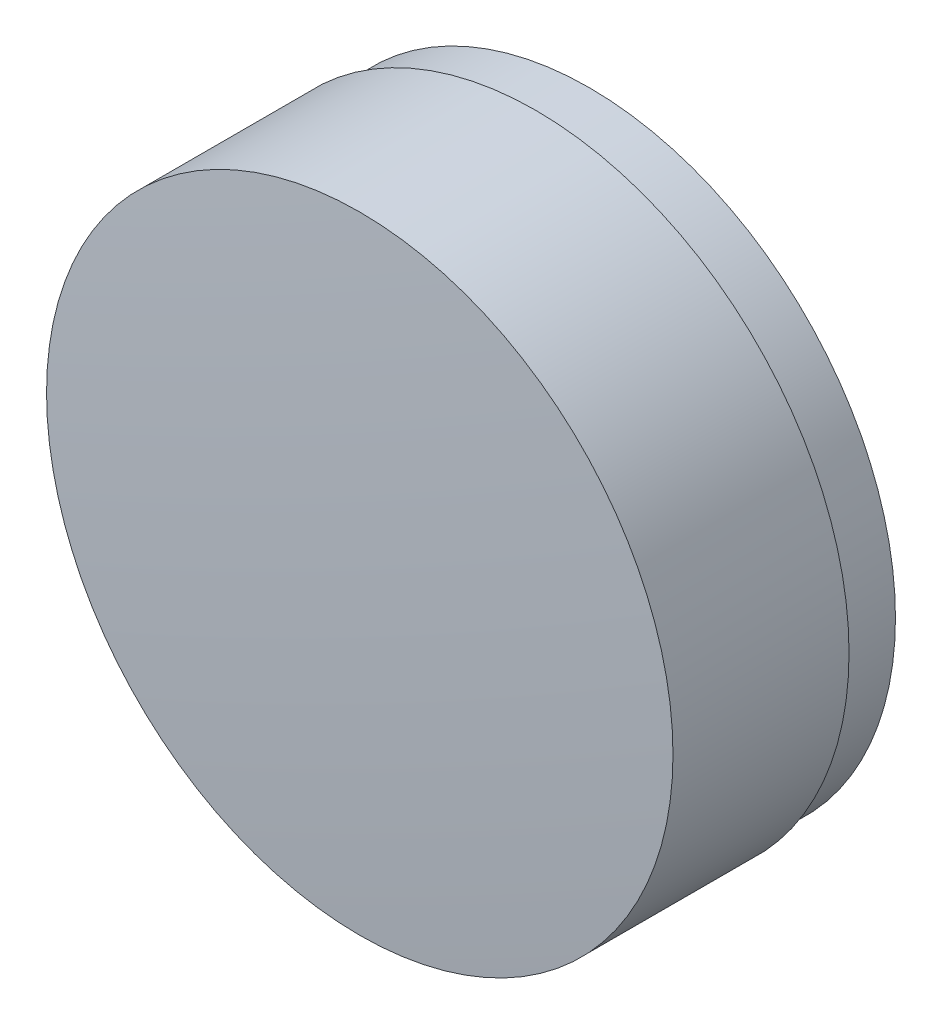
ISO-10303-21;
HEADER;
FILE_DESCRIPTION(('STEP AP214'),'2;1');
FILE_NAME('part.step','',(''),(''),'','','');
FILE_SCHEMA(('AUTOMOTIVE_DESIGN { 1 0 10303 214 1 1 1 1 }'));
ENDSEC;
DATA;
#1=APPLICATION_CONTEXT('core data for automotive mechanical design processes');
#2=APPLICATION_PROTOCOL_DEFINITION('international standard','automotive_design',2000,#1);
#3=PRODUCT_CONTEXT('',#1,'mechanical');
#4=PRODUCT('Part','Part','',(#3));
#5=PRODUCT_RELATED_PRODUCT_CATEGORY('part','',(#4));
#6=PRODUCT_DEFINITION_FORMATION('','',#4);
#7=PRODUCT_DEFINITION_CONTEXT('part definition',#1,'design');
#8=PRODUCT_DEFINITION('design','',#6,#7);
#9=PRODUCT_DEFINITION_SHAPE('','',#8);
#10=(LENGTH_UNIT() NAMED_UNIT(*) SI_UNIT(.MILLI.,.METRE.));
#11=(NAMED_UNIT(*) PLANE_ANGLE_UNIT() SI_UNIT($,.RADIAN.));
#12=(NAMED_UNIT(*) SI_UNIT($,.STERADIAN.) SOLID_ANGLE_UNIT());
#13=UNCERTAINTY_MEASURE_WITH_UNIT(LENGTH_MEASURE(1.E-05),#10,'distance_accuracy_value','');
#14=(GEOMETRIC_REPRESENTATION_CONTEXT(3) GLOBAL_UNCERTAINTY_ASSIGNED_CONTEXT((#13)) GLOBAL_UNIT_ASSIGNED_CONTEXT((#10,
#11,#12)) REPRESENTATION_CONTEXT('',''));
#15=CARTESIAN_POINT('',(0.,0.,0.));
#16=DIRECTION('',(0.,0.,1.));
#17=DIRECTION('',(1.,0.,0.));
#18=AXIS2_PLACEMENT_3D('',#15,#16,#17);
#19=CARTESIAN_POINT('',(0.,0.,-21.193));
#20=DIRECTION('',(0.,0.,-1.));
#21=DIRECTION('',(0.,-1.,0.));
#22=AXIS2_PLACEMENT_3D('',#19,#20,#21);
#23=SPHERICAL_SURFACE('',#22,21.193);
#24=CARTESIAN_POINT('',(0.,0.,-0.686397429120542));
#25=DIRECTION('',(0.,0.,-1.));
#26=DIRECTION('',(-1.,0.,0.));
#27=AXIS2_PLACEMENT_3D('',#24,#25,#26);
#28=CIRCLE('',#27,5.35);
#29=CARTESIAN_POINT('',(-5.35,0.,-0.686397429120542));
#30=VERTEX_POINT('',#29);
#31=EDGE_CURVE('E10',#30,#30,#28,.T.);
#32=ORIENTED_EDGE('',*,*,#31,.T.);
#33=EDGE_LOOP('',(#32));
#34=FACE_BOUND('',#33,.T.);
#35=ADVANCED_FACE('F30',(#34),#23,.F.);
#36=CARTESIAN_POINT('',(0.,0.,-2.16910776070164));
#37=DIRECTION('',(0.,0.,-1.));
#38=DIRECTION('',(-1.,0.,0.));
#39=AXIS2_PLACEMENT_3D('',#36,#37,#38);
#40=CYLINDRICAL_SURFACE('',#39,5.35);
#41=CARTESIAN_POINT('',(0.,0.,0.250000000000001));
#42=DIRECTION('',(0.,0.,-1.));
#43=DIRECTION('',(-1.,0.,0.));
#44=AXIS2_PLACEMENT_3D('',#41,#42,#43);
#45=CIRCLE('',#44,5.35);
#46=CARTESIAN_POINT('',(-5.35,0.,0.250000000000001));
#47=VERTEX_POINT('',#46);
#48=EDGE_CURVE('E36',#47,#47,#45,.T.);
#49=ORIENTED_EDGE('',*,*,#48,.T.);
#50=EDGE_LOOP('',(#49));
#51=FACE_BOUND('',#50,.T.);
#52=ORIENTED_EDGE('',*,*,#31,.F.);
#53=EDGE_LOOP('',(#52));
#54=FACE_BOUND('',#53,.T.);
#55=ADVANCED_FACE('F62',(#51,#54),#40,.T.);
#56=CARTESIAN_POINT('',(0.,5.35,0.250000000000001));
#57=DIRECTION('',(0.,0.,-1.));
#58=DIRECTION('',(-1.,0.,0.));
#59=AXIS2_PLACEMENT_3D('',#56,#57,#58);
#60=PLANE('',#59);
#61=CARTESIAN_POINT('',(0.,0.,0.250000000000001));
#62=DIRECTION('',(0.,0.,-1.));
#63=DIRECTION('',(-1.,0.,0.));
#64=AXIS2_PLACEMENT_3D('',#61,#62,#63);
#65=CIRCLE('',#64,5.475);
#66=CARTESIAN_POINT('',(-5.475,0.,0.250000000000001));
#67=VERTEX_POINT('',#66);
#68=EDGE_CURVE('E40',#67,#67,#65,.T.);
#69=ORIENTED_EDGE('',*,*,#68,.T.);
#70=EDGE_LOOP('',(#69));
#71=FACE_BOUND('',#70,.T.);
#72=ORIENTED_EDGE('',*,*,#48,.F.);
#73=EDGE_LOOP('',(#72));
#74=FACE_BOUND('',#73,.T.);
#75=ADVANCED_FACE('F59',(#71,#74),#60,.T.);
#76=CARTESIAN_POINT('',(0.,0.,-2.16910776070164));
#77=DIRECTION('',(0.,0.,-1.));
#78=DIRECTION('',(-1.,0.,0.));
#79=AXIS2_PLACEMENT_3D('',#76,#77,#78);
#80=CYLINDRICAL_SURFACE('',#79,5.475);
#81=CARTESIAN_POINT('',(0.,0.,3.32730469378638));
#82=DIRECTION('',(0.,0.,-1.));
#83=DIRECTION('',(-1.,0.,0.));
#84=AXIS2_PLACEMENT_3D('',#81,#82,#83);
#85=CIRCLE('',#84,5.47500000000001);
#86=CARTESIAN_POINT('',(-5.47500000000001,0.,3.32730469378638));
#87=VERTEX_POINT('',#86);
#88=EDGE_CURVE('E44',#87,#87,#85,.T.);
#89=ORIENTED_EDGE('',*,*,#88,.T.);
#90=EDGE_LOOP('',(#89));
#91=FACE_BOUND('',#90,.T.);
#92=ORIENTED_EDGE('',*,*,#68,.F.);
#93=EDGE_LOOP('',(#92));
#94=FACE_BOUND('',#93,.T.);
#95=ADVANCED_FACE('F50',(#91,#94),#80,.T.);
#96=CARTESIAN_POINT('',(0.,0.,-88.7133199999998));
#97=DIRECTION('',(0.,0.,-1.));
#98=DIRECTION('',(0.,1.,0.));
#99=AXIS2_PLACEMENT_3D('',#96,#97,#98);
#100=SPHERICAL_SURFACE('',#99,92.20332);
#101=ORIENTED_EDGE('',*,*,#88,.F.);
#102=EDGE_LOOP('',(#101));
#103=FACE_BOUND('',#102,.T.);
#104=ADVANCED_FACE('F53',(#103),#100,.T.);
#105=CLOSED_SHELL('',(#35,#55,#75,#95,#104));
#106=MANIFOLD_SOLID_BREP('B2',#105);
#107=ADVANCED_BREP_SHAPE_REPRESENTATION('',(#18,#106),#14);
#108=SHAPE_DEFINITION_REPRESENTATION(#9,#107);
ENDSEC;
END-ISO-10303-21;
